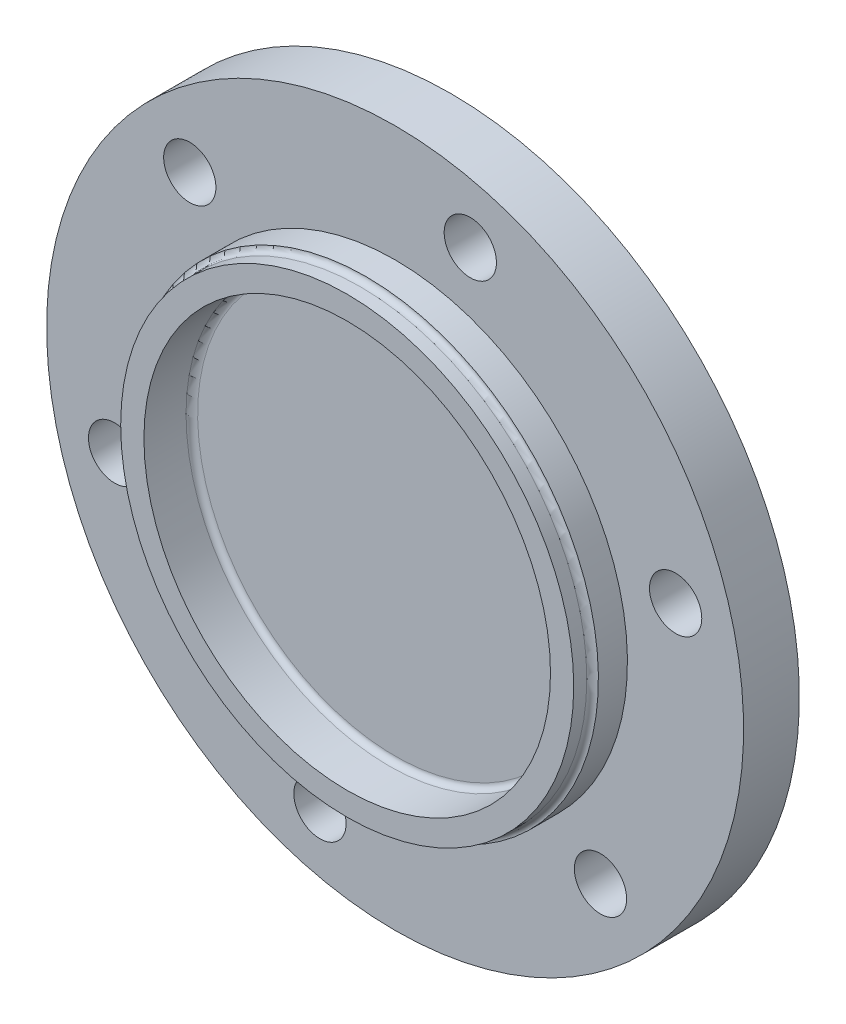
ISO-10303-21;
HEADER;
FILE_DESCRIPTION(('STEP AP214'),'2;1');
FILE_NAME('part.step','',(''),(''),'','','');
FILE_SCHEMA(('AUTOMOTIVE_DESIGN { 1 0 10303 214 1 1 1 1 }'));
ENDSEC;
DATA;
#1=APPLICATION_CONTEXT('core data for automotive mechanical design processes');
#2=APPLICATION_PROTOCOL_DEFINITION('international standard','automotive_design',2000,#1);
#3=PRODUCT_CONTEXT('',#1,'mechanical');
#4=PRODUCT('Part','Part','',(#3));
#5=PRODUCT_RELATED_PRODUCT_CATEGORY('part','',(#4));
#6=PRODUCT_DEFINITION_FORMATION('','',#4);
#7=PRODUCT_DEFINITION_CONTEXT('part definition',#1,'design');
#8=PRODUCT_DEFINITION('design','',#6,#7);
#9=PRODUCT_DEFINITION_SHAPE('','',#8);
#10=(LENGTH_UNIT() NAMED_UNIT(*) SI_UNIT(.MILLI.,.METRE.));
#11=(NAMED_UNIT(*) PLANE_ANGLE_UNIT() SI_UNIT($,.RADIAN.));
#12=(NAMED_UNIT(*) SI_UNIT($,.STERADIAN.) SOLID_ANGLE_UNIT());
#13=UNCERTAINTY_MEASURE_WITH_UNIT(LENGTH_MEASURE(1.E-05),#10,'distance_accuracy_value','');
#14=(GEOMETRIC_REPRESENTATION_CONTEXT(3) GLOBAL_UNCERTAINTY_ASSIGNED_CONTEXT((#13)) GLOBAL_UNIT_ASSIGNED_CONTEXT((#10,
#11,#12)) REPRESENTATION_CONTEXT('',''));
#15=CARTESIAN_POINT('',(0.,0.,0.));
#16=DIRECTION('',(0.,0.,1.));
#17=DIRECTION('',(1.,0.,0.));
#18=AXIS2_PLACEMENT_3D('',#15,#16,#17);
#19=CARTESIAN_POINT('',(0.,38.,-7.6));
#20=DIRECTION('',(0.,0.,-1.));
#21=DIRECTION('',(0.,1.,0.));
#22=AXIS2_PLACEMENT_3D('',#19,#20,#21);
#23=PLANE('',#22);
#24=CARTESIAN_POINT('',(0.,0.,-7.60000000000001));
#25=DIRECTION('',(0.,0.,-1.));
#26=DIRECTION('',(0.,1.,0.));
#27=AXIS2_PLACEMENT_3D('',#24,#25,#26);
#28=CIRCLE('',#27,38.);
#29=CARTESIAN_POINT('',(0.,38.,-7.6));
#30=VERTEX_POINT('',#29);
#31=EDGE_CURVE('E10',#30,#30,#28,.T.);
#32=ORIENTED_EDGE('',*,*,#31,.T.);
#33=EDGE_LOOP('',(#32));
#34=FACE_BOUND('',#33,.T.);
#35=ADVANCED_FACE('F37',(#34),#23,.T.);
#36=CARTESIAN_POINT('',(0.,0.,-7.60000000000001));
#37=DIRECTION('',(0.,0.,-1.));
#38=DIRECTION('',(0.,1.,0.));
#39=AXIS2_PLACEMENT_3D('',#36,#37,#38);
#40=CONICAL_SURFACE('',#39,38.,0.785398163397449);
#41=CARTESIAN_POINT('',(0.,0.,-9.60000000000001));
#42=DIRECTION('',(0.,0.,-1.));
#43=DIRECTION('',(0.,1.,0.));
#44=AXIS2_PLACEMENT_3D('',#41,#42,#43);
#45=CIRCLE('',#44,40.);
#46=CARTESIAN_POINT('',(0.,40.,-9.6));
#47=VERTEX_POINT('',#46);
#48=EDGE_CURVE('E43',#47,#47,#45,.T.);
#49=ORIENTED_EDGE('',*,*,#48,.T.);
#50=EDGE_LOOP('',(#49));
#51=FACE_BOUND('',#50,.T.);
#52=ORIENTED_EDGE('',*,*,#31,.F.);
#53=EDGE_LOOP('',(#52));
#54=FACE_BOUND('',#53,.T.);
#55=ADVANCED_FACE('F121',(#51,#54),#40,.F.);
#56=CARTESIAN_POINT('',(0.,60.,-9.6));
#57=DIRECTION('',(0.,0.,-1.));
#58=DIRECTION('',(0.,1.,0.));
#59=AXIS2_PLACEMENT_3D('',#56,#57,#58);
#60=PLANE('',#59);
#61=CARTESIAN_POINT('',(-48.2962913144536,-12.9409522551255,-9.60000000000001));
#62=DIRECTION('',(0.,0.,-1.));
#63=DIRECTION('',(0.,1.,0.));
#64=AXIS2_PLACEMENT_3D('',#61,#62,#63);
#65=CIRCLE('',#64,4.5);
#66=CARTESIAN_POINT('',(-48.2962913144536,-8.44095225512554,-9.60000000000001));
#67=VERTEX_POINT('',#66);
#68=EDGE_CURVE('E110',#67,#67,#65,.T.);
#69=ORIENTED_EDGE('',*,*,#68,.F.);
#70=EDGE_LOOP('',(#69));
#71=FACE_BOUND('',#70,.T.);
#72=CARTESIAN_POINT('',(-12.9409522551264,-48.2962913144533,-9.60000000000001));
#73=DIRECTION('',(0.,0.,-1.));
#74=DIRECTION('',(0.,1.,0.));
#75=AXIS2_PLACEMENT_3D('',#72,#73,#74);
#76=CIRCLE('',#75,4.5);
#77=CARTESIAN_POINT('',(-12.9409522551264,-43.7962913144533,-9.60000000000001));
#78=VERTEX_POINT('',#77);
#79=EDGE_CURVE('E104',#78,#78,#76,.T.);
#80=ORIENTED_EDGE('',*,*,#79,.F.);
#81=EDGE_LOOP('',(#80));
#82=FACE_BOUND('',#81,.T.);
#83=CARTESIAN_POINT('',(35.3553390593274,-35.3553390593273,-9.60000000000001));
#84=DIRECTION('',(0.,0.,-1.));
#85=DIRECTION('',(0.,1.,0.));
#86=AXIS2_PLACEMENT_3D('',#83,#84,#85);
#87=CIRCLE('',#86,4.5);
#88=CARTESIAN_POINT('',(35.3553390593274,-30.8553390593273,-9.60000000000001));
#89=VERTEX_POINT('',#88);
#90=EDGE_CURVE('E98',#89,#89,#87,.T.);
#91=ORIENTED_EDGE('',*,*,#90,.F.);
#92=EDGE_LOOP('',(#91));
#93=FACE_BOUND('',#92,.T.);
#94=CARTESIAN_POINT('',(48.2962913144535,12.9409522551259,-9.60000000000001));
#95=DIRECTION('',(0.,0.,-1.));
#96=DIRECTION('',(0.,1.,0.));
#97=AXIS2_PLACEMENT_3D('',#94,#95,#96);
#98=CIRCLE('',#97,4.5);
#99=CARTESIAN_POINT('',(48.2962913144535,17.4409522551259,-9.60000000000001));
#100=VERTEX_POINT('',#99);
#101=EDGE_CURVE('E92',#100,#100,#98,.T.);
#102=ORIENTED_EDGE('',*,*,#101,.F.);
#103=EDGE_LOOP('',(#102));
#104=FACE_BOUND('',#103,.T.);
#105=CARTESIAN_POINT('',(12.9409522551261,48.2962913144534,-9.6));
#106=DIRECTION('',(0.,0.,-1.));
#107=DIRECTION('',(0.,1.,0.));
#108=AXIS2_PLACEMENT_3D('',#105,#106,#107);
#109=CIRCLE('',#108,4.5);
#110=CARTESIAN_POINT('',(12.9409522551261,52.7962913144534,-9.6));
#111=VERTEX_POINT('',#110);
#112=EDGE_CURVE('E86',#111,#111,#109,.T.);
#113=ORIENTED_EDGE('',*,*,#112,.F.);
#114=EDGE_LOOP('',(#113));
#115=FACE_BOUND('',#114,.T.);
#116=CARTESIAN_POINT('',(-35.3553390593274,35.3553390593273,-9.6));
#117=DIRECTION('',(0.,0.,-1.));
#118=DIRECTION('',(0.,1.,0.));
#119=AXIS2_PLACEMENT_3D('',#116,#117,#118);
#120=CIRCLE('',#119,4.5);
#121=CARTESIAN_POINT('',(-35.3553390593274,39.8553390593273,-9.6));
#122=VERTEX_POINT('',#121);
#123=EDGE_CURVE('E80',#122,#122,#120,.T.);
#124=ORIENTED_EDGE('',*,*,#123,.F.);
#125=EDGE_LOOP('',(#124));
#126=FACE_BOUND('',#125,.T.);
#127=CARTESIAN_POINT('',(0.,0.,-9.60000000000001));
#128=DIRECTION('',(0.,0.,-1.));
#129=DIRECTION('',(0.,1.,0.));
#130=AXIS2_PLACEMENT_3D('',#127,#128,#129);
#131=CIRCLE('',#130,60.);
#132=CARTESIAN_POINT('',(0.,60.,-9.6));
#133=VERTEX_POINT('',#132);
#134=EDGE_CURVE('E47',#133,#133,#131,.T.);
#135=ORIENTED_EDGE('',*,*,#134,.T.);
#136=EDGE_LOOP('',(#135));
#137=FACE_BOUND('',#136,.T.);
#138=ORIENTED_EDGE('',*,*,#48,.F.);
#139=EDGE_LOOP('',(#138));
#140=FACE_BOUND('',#139,.T.);
#141=ADVANCED_FACE('F117',(#71,#82,#93,#104,#115,#126,#137,#140),#60,.T.);
#142=CARTESIAN_POINT('',(0.,0.,-9.6));
#143=DIRECTION('',(0.,0.,-1.));
#144=DIRECTION('',(0.,1.,0.));
#145=AXIS2_PLACEMENT_3D('',#142,#143,#144);
#146=CYLINDRICAL_SURFACE('',#145,60.);
#147=CARTESIAN_POINT('',(0.,0.,0.));
#148=DIRECTION('',(0.,0.,-1.));
#149=DIRECTION('',(0.,1.,0.));
#150=AXIS2_PLACEMENT_3D('',#147,#148,#149);
#151=CIRCLE('',#150,60.);
#152=CARTESIAN_POINT('',(0.,60.,0.));
#153=VERTEX_POINT('',#152);
#154=EDGE_CURVE('E51',#153,#153,#151,.T.);
#155=ORIENTED_EDGE('',*,*,#154,.T.);
#156=EDGE_LOOP('',(#155));
#157=FACE_BOUND('',#156,.T.);
#158=ORIENTED_EDGE('',*,*,#134,.F.);
#159=EDGE_LOOP('',(#158));
#160=FACE_BOUND('',#159,.T.);
#161=ADVANCED_FACE('F120',(#157,#160),#146,.T.);
#162=CARTESIAN_POINT('',(0.,40.,0.));
#163=DIRECTION('',(0.,0.,1.));
#164=DIRECTION('',(0.,-1.,0.));
#165=AXIS2_PLACEMENT_3D('',#162,#163,#164);
#166=PLANE('',#165);
#167=CARTESIAN_POINT('',(-48.2962913144536,-12.9409522551255,0.));
#168=DIRECTION('',(0.,0.,1.));
#169=DIRECTION('',(0.,-1.,0.));
#170=AXIS2_PLACEMENT_3D('',#167,#168,#169);
#171=CIRCLE('',#170,4.5);
#172=CARTESIAN_POINT('',(-48.2962913144536,-17.4409522551255,0.));
#173=VERTEX_POINT('',#172);
#174=EDGE_CURVE('E107',#173,#173,#171,.T.);
#175=ORIENTED_EDGE('',*,*,#174,.F.);
#176=EDGE_LOOP('',(#175));
#177=FACE_BOUND('',#176,.T.);
#178=CARTESIAN_POINT('',(-12.9409522551264,-48.2962913144533,0.));
#179=DIRECTION('',(0.,0.,1.));
#180=DIRECTION('',(0.,-1.,0.));
#181=AXIS2_PLACEMENT_3D('',#178,#179,#180);
#182=CIRCLE('',#181,4.5);
#183=CARTESIAN_POINT('',(-12.9409522551264,-52.7962913144533,0.));
#184=VERTEX_POINT('',#183);
#185=EDGE_CURVE('E101',#184,#184,#182,.T.);
#186=ORIENTED_EDGE('',*,*,#185,.F.);
#187=EDGE_LOOP('',(#186));
#188=FACE_BOUND('',#187,.T.);
#189=CARTESIAN_POINT('',(35.3553390593274,-35.3553390593273,0.));
#190=DIRECTION('',(0.,0.,1.));
#191=DIRECTION('',(0.,-1.,0.));
#192=AXIS2_PLACEMENT_3D('',#189,#190,#191);
#193=CIRCLE('',#192,4.5);
#194=CARTESIAN_POINT('',(35.3553390593274,-39.8553390593273,0.));
#195=VERTEX_POINT('',#194);
#196=EDGE_CURVE('E95',#195,#195,#193,.T.);
#197=ORIENTED_EDGE('',*,*,#196,.F.);
#198=EDGE_LOOP('',(#197));
#199=FACE_BOUND('',#198,.T.);
#200=CARTESIAN_POINT('',(48.2962913144535,12.9409522551259,0.));
#201=DIRECTION('',(0.,0.,1.));
#202=DIRECTION('',(0.,-1.,0.));
#203=AXIS2_PLACEMENT_3D('',#200,#201,#202);
#204=CIRCLE('',#203,4.5);
#205=CARTESIAN_POINT('',(48.2962913144535,8.44095225512588,0.));
#206=VERTEX_POINT('',#205);
#207=EDGE_CURVE('E89',#206,#206,#204,.T.);
#208=ORIENTED_EDGE('',*,*,#207,.F.);
#209=EDGE_LOOP('',(#208));
#210=FACE_BOUND('',#209,.T.);
#211=CARTESIAN_POINT('',(12.9409522551261,48.2962913144534,0.));
#212=DIRECTION('',(0.,0.,1.));
#213=DIRECTION('',(0.,-1.,0.));
#214=AXIS2_PLACEMENT_3D('',#211,#212,#213);
#215=CIRCLE('',#214,4.5);
#216=CARTESIAN_POINT('',(12.9409522551261,43.7962913144534,0.));
#217=VERTEX_POINT('',#216);
#218=EDGE_CURVE('E83',#217,#217,#215,.T.);
#219=ORIENTED_EDGE('',*,*,#218,.F.);
#220=EDGE_LOOP('',(#219));
#221=FACE_BOUND('',#220,.T.);
#222=CARTESIAN_POINT('',(-35.3553390593274,35.3553390593273,0.));
#223=DIRECTION('',(0.,0.,1.));
#224=DIRECTION('',(0.,-1.,0.));
#225=AXIS2_PLACEMENT_3D('',#222,#223,#224);
#226=CIRCLE('',#225,4.5);
#227=CARTESIAN_POINT('',(-35.3553390593274,30.8553390593273,0.));
#228=VERTEX_POINT('',#227);
#229=EDGE_CURVE('E77',#228,#228,#226,.T.);
#230=ORIENTED_EDGE('',*,*,#229,.F.);
#231=EDGE_LOOP('',(#230));
#232=FACE_BOUND('',#231,.T.);
#233=CARTESIAN_POINT('',(0.,0.,0.));
#234=DIRECTION('',(0.,0.,-1.));
#235=DIRECTION('',(0.,1.,0.));
#236=AXIS2_PLACEMENT_3D('',#233,#234,#235);
#237=CIRCLE('',#236,40.);
#238=CARTESIAN_POINT('',(0.,40.,0.));
#239=VERTEX_POINT('',#238);
#240=EDGE_CURVE('E56',#239,#239,#237,.T.);
#241=ORIENTED_EDGE('',*,*,#240,.T.);
#242=EDGE_LOOP('',(#241));
#243=FACE_BOUND('',#242,.T.);
#244=ORIENTED_EDGE('',*,*,#154,.F.);
#245=EDGE_LOOP('',(#244));
#246=FACE_BOUND('',#245,.T.);
#247=ADVANCED_FACE('F137',(#177,#188,#199,#210,#221,#232,#243,#246),#166,.T.);
#248=CARTESIAN_POINT('',(0.,0.,-9.6));
#249=DIRECTION('',(0.,0.,-1.));
#250=DIRECTION('',(0.,1.,0.));
#251=AXIS2_PLACEMENT_3D('',#248,#249,#250);
#252=CYLINDRICAL_SURFACE('',#251,40.);
#253=CARTESIAN_POINT('',(0.,0.,5.));
#254=DIRECTION('',(0.,0.,-1.));
#255=DIRECTION('',(0.,1.,0.));
#256=AXIS2_PLACEMENT_3D('',#253,#254,#255);
#257=CIRCLE('',#256,40.);
#258=CARTESIAN_POINT('',(0.,40.,5.));
#259=VERTEX_POINT('',#258);
#260=EDGE_CURVE('E59',#259,#259,#257,.T.);
#261=ORIENTED_EDGE('',*,*,#260,.T.);
#262=EDGE_LOOP('',(#261));
#263=FACE_BOUND('',#262,.T.);
#264=ORIENTED_EDGE('',*,*,#240,.F.);
#265=EDGE_LOOP('',(#264));
#266=FACE_BOUND('',#265,.T.);
#267=ADVANCED_FACE('F145',(#263,#266),#252,.T.);
#268=CARTESIAN_POINT('',(0.,0.,5.99999999999999));
#269=DIRECTION('',(0.,0.,-1.));
#270=DIRECTION('',(0.,1.,0.));
#271=AXIS2_PLACEMENT_3D('',#268,#269,#270);
#272=TOROIDAL_SURFACE('',#271,40.,0.999999999999997);
#273=CARTESIAN_POINT('',(0.,0.,5.99999999999999));
#274=DIRECTION('',(0.,0.,-1.));
#275=DIRECTION('',(0.,1.,0.));
#276=AXIS2_PLACEMENT_3D('',#273,#274,#275);
#277=CIRCLE('',#276,39.);
#278=CARTESIAN_POINT('',(0.,39.,6.));
#279=VERTEX_POINT('',#278);
#280=EDGE_CURVE('E62',#279,#279,#277,.T.);
#281=ORIENTED_EDGE('',*,*,#280,.T.);
#282=EDGE_LOOP('',(#281));
#283=FACE_BOUND('',#282,.T.);
#284=ORIENTED_EDGE('',*,*,#260,.F.);
#285=EDGE_LOOP('',(#284));
#286=FACE_BOUND('',#285,.T.);
#287=ADVANCED_FACE('F174',(#283,#286),#272,.F.);
#288=CARTESIAN_POINT('',(0.,0.,-9.6));
#289=DIRECTION('',(0.,0.,-1.));
#290=DIRECTION('',(0.,1.,0.));
#291=AXIS2_PLACEMENT_3D('',#288,#289,#290);
#292=CYLINDRICAL_SURFACE('',#291,39.);
#293=CARTESIAN_POINT('',(0.,0.,8.25));
#294=DIRECTION('',(0.,0.,-1.));
#295=DIRECTION('',(0.,1.,0.));
#296=AXIS2_PLACEMENT_3D('',#293,#294,#295);
#297=CIRCLE('',#296,39.);
#298=CARTESIAN_POINT('',(0.,39.,8.25));
#299=VERTEX_POINT('',#298);
#300=EDGE_CURVE('E65',#299,#299,#297,.T.);
#301=ORIENTED_EDGE('',*,*,#300,.T.);
#302=EDGE_LOOP('',(#301));
#303=FACE_BOUND('',#302,.T.);
#304=ORIENTED_EDGE('',*,*,#280,.F.);
#305=EDGE_LOOP('',(#304));
#306=FACE_BOUND('',#305,.T.);
#307=ADVANCED_FACE('F182',(#303,#306),#292,.T.);
#308=CARTESIAN_POINT('',(0.,35.,8.25));
#309=DIRECTION('',(0.,0.,1.));
#310=DIRECTION('',(0.,-1.,0.));
#311=AXIS2_PLACEMENT_3D('',#308,#309,#310);
#312=PLANE('',#311);
#313=CARTESIAN_POINT('',(0.,0.,8.25));
#314=DIRECTION('',(0.,0.,-1.));
#315=DIRECTION('',(0.,1.,0.));
#316=AXIS2_PLACEMENT_3D('',#313,#314,#315);
#317=CIRCLE('',#316,35.);
#318=CARTESIAN_POINT('',(0.,35.,8.25));
#319=VERTEX_POINT('',#318);
#320=EDGE_CURVE('E68',#319,#319,#317,.T.);
#321=ORIENTED_EDGE('',*,*,#320,.T.);
#322=EDGE_LOOP('',(#321));
#323=FACE_BOUND('',#322,.T.);
#324=ORIENTED_EDGE('',*,*,#300,.F.);
#325=EDGE_LOOP('',(#324));
#326=FACE_BOUND('',#325,.T.);
#327=ADVANCED_FACE('F190',(#323,#326),#312,.T.);
#328=CARTESIAN_POINT('',(0.,0.,-9.6));
#329=DIRECTION('',(0.,0.,-1.));
#330=DIRECTION('',(0.,1.,0.));
#331=AXIS2_PLACEMENT_3D('',#328,#329,#330);
#332=CYLINDRICAL_SURFACE('',#331,35.);
#333=CARTESIAN_POINT('',(0.,0.,0.999999999999997));
#334=DIRECTION('',(0.,0.,-1.));
#335=DIRECTION('',(0.,1.,0.));
#336=AXIS2_PLACEMENT_3D('',#333,#334,#335);
#337=CIRCLE('',#336,35.);
#338=CARTESIAN_POINT('',(0.,35.,1.));
#339=VERTEX_POINT('',#338);
#340=EDGE_CURVE('E71',#339,#339,#337,.T.);
#341=ORIENTED_EDGE('',*,*,#340,.T.);
#342=EDGE_LOOP('',(#341));
#343=FACE_BOUND('',#342,.T.);
#344=ORIENTED_EDGE('',*,*,#320,.F.);
#345=EDGE_LOOP('',(#344));
#346=FACE_BOUND('',#345,.T.);
#347=ADVANCED_FACE('F198',(#343,#346),#332,.F.);
#348=CARTESIAN_POINT('',(0.,0.,0.999999999999997));
#349=DIRECTION('',(0.,0.,-1.));
#350=DIRECTION('',(0.,1.,0.));
#351=AXIS2_PLACEMENT_3D('',#348,#349,#350);
#352=TOROIDAL_SURFACE('',#351,34.,1.);
#353=CARTESIAN_POINT('',(0.,0.,0.));
#354=DIRECTION('',(0.,0.,-1.));
#355=DIRECTION('',(0.,1.,0.));
#356=AXIS2_PLACEMENT_3D('',#353,#354,#355);
#357=CIRCLE('',#356,34.);
#358=CARTESIAN_POINT('',(0.,34.,0.));
#359=VERTEX_POINT('',#358);
#360=EDGE_CURVE('E74',#359,#359,#357,.T.);
#361=ORIENTED_EDGE('',*,*,#360,.T.);
#362=EDGE_LOOP('',(#361));
#363=FACE_BOUND('',#362,.T.);
#364=ORIENTED_EDGE('',*,*,#340,.F.);
#365=EDGE_LOOP('',(#364));
#366=FACE_BOUND('',#365,.T.);
#367=ADVANCED_FACE('F206',(#363,#366),#352,.F.);
#368=CARTESIAN_POINT('',(0.,0.,0.));
#369=DIRECTION('',(0.,0.,1.));
#370=DIRECTION('',(0.,-1.,0.));
#371=AXIS2_PLACEMENT_3D('',#368,#369,#370);
#372=PLANE('',#371);
#373=ORIENTED_EDGE('',*,*,#360,.F.);
#374=EDGE_LOOP('',(#373));
#375=FACE_BOUND('',#374,.T.);
#376=ADVANCED_FACE('F214',(#375),#372,.T.);
#377=CARTESIAN_POINT('',(-35.3553390593274,35.3553390593273,-9.6));
#378=DIRECTION('',(0.,0.,-1.));
#379=DIRECTION('',(0.,1.,0.));
#380=AXIS2_PLACEMENT_3D('',#377,#378,#379);
#381=CYLINDRICAL_SURFACE('',#380,4.5);
#382=ORIENTED_EDGE('',*,*,#123,.T.);
#383=EDGE_LOOP('',(#382));
#384=FACE_BOUND('',#383,.T.);
#385=ORIENTED_EDGE('',*,*,#229,.T.);
#386=EDGE_LOOP('',(#385));
#387=FACE_BOUND('',#386,.T.);
#388=ADVANCED_FACE('F222',(#384,#387),#381,.F.);
#389=CARTESIAN_POINT('',(12.9409522551261,48.2962913144534,-9.6));
#390=DIRECTION('',(0.,0.,-1.));
#391=DIRECTION('',(0.,1.,0.));
#392=AXIS2_PLACEMENT_3D('',#389,#390,#391);
#393=CYLINDRICAL_SURFACE('',#392,4.5);
#394=ORIENTED_EDGE('',*,*,#112,.T.);
#395=EDGE_LOOP('',(#394));
#396=FACE_BOUND('',#395,.T.);
#397=ORIENTED_EDGE('',*,*,#218,.T.);
#398=EDGE_LOOP('',(#397));
#399=FACE_BOUND('',#398,.T.);
#400=ADVANCED_FACE('F229',(#396,#399),#393,.F.);
#401=CARTESIAN_POINT('',(48.2962913144535,12.9409522551259,-9.60000000000001));
#402=DIRECTION('',(0.,0.,-1.));
#403=DIRECTION('',(0.,1.,0.));
#404=AXIS2_PLACEMENT_3D('',#401,#402,#403);
#405=CYLINDRICAL_SURFACE('',#404,4.5);
#406=ORIENTED_EDGE('',*,*,#101,.T.);
#407=EDGE_LOOP('',(#406));
#408=FACE_BOUND('',#407,.T.);
#409=ORIENTED_EDGE('',*,*,#207,.T.);
#410=EDGE_LOOP('',(#409));
#411=FACE_BOUND('',#410,.T.);
#412=ADVANCED_FACE('F236',(#408,#411),#405,.F.);
#413=CARTESIAN_POINT('',(35.3553390593274,-35.3553390593273,-9.60000000000001));
#414=DIRECTION('',(0.,0.,-1.));
#415=DIRECTION('',(0.,1.,0.));
#416=AXIS2_PLACEMENT_3D('',#413,#414,#415);
#417=CYLINDRICAL_SURFACE('',#416,4.5);
#418=ORIENTED_EDGE('',*,*,#90,.T.);
#419=EDGE_LOOP('',(#418));
#420=FACE_BOUND('',#419,.T.);
#421=ORIENTED_EDGE('',*,*,#196,.T.);
#422=EDGE_LOOP('',(#421));
#423=FACE_BOUND('',#422,.T.);
#424=ADVANCED_FACE('F244',(#420,#423),#417,.F.);
#425=CARTESIAN_POINT('',(-12.9409522551264,-48.2962913144533,-9.60000000000001));
#426=DIRECTION('',(0.,0.,-1.));
#427=DIRECTION('',(0.,1.,0.));
#428=AXIS2_PLACEMENT_3D('',#425,#426,#427);
#429=CYLINDRICAL_SURFACE('',#428,4.5);
#430=ORIENTED_EDGE('',*,*,#79,.T.);
#431=EDGE_LOOP('',(#430));
#432=FACE_BOUND('',#431,.T.);
#433=ORIENTED_EDGE('',*,*,#185,.T.);
#434=EDGE_LOOP('',(#433));
#435=FACE_BOUND('',#434,.T.);
#436=ADVANCED_FACE('F252',(#432,#435),#429,.F.);
#437=CARTESIAN_POINT('',(-48.2962913144536,-12.9409522551255,-9.60000000000001));
#438=DIRECTION('',(0.,0.,-1.));
#439=DIRECTION('',(0.,1.,0.));
#440=AXIS2_PLACEMENT_3D('',#437,#438,#439);
#441=CYLINDRICAL_SURFACE('',#440,4.5);
#442=ORIENTED_EDGE('',*,*,#68,.T.);
#443=EDGE_LOOP('',(#442));
#444=FACE_BOUND('',#443,.T.);
#445=ORIENTED_EDGE('',*,*,#174,.T.);
#446=EDGE_LOOP('',(#445));
#447=FACE_BOUND('',#446,.T.);
#448=ADVANCED_FACE('F114',(#444,#447),#441,.F.);
#449=CLOSED_SHELL('',(#35,#55,#141,#161,#247,#267,#287,#307,#327,#347,#367,#376,#388,#400,#412,
#424,#436,#448));
#450=MANIFOLD_SOLID_BREP('B2',#449);
#451=ADVANCED_BREP_SHAPE_REPRESENTATION('',(#18,#450),#14);
#452=SHAPE_DEFINITION_REPRESENTATION(#9,#451);
ENDSEC;
END-ISO-10303-21;
